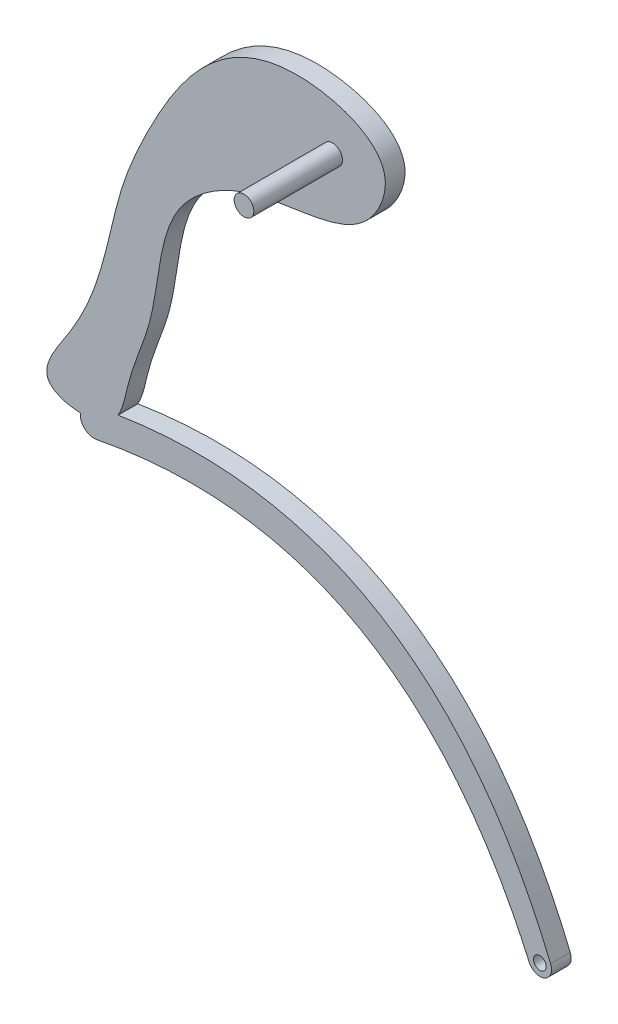
ISO-10303-21;
HEADER;
FILE_DESCRIPTION(('STEP AP214'),'2;1');
FILE_NAME('part.step','',(''),(''),'','','');
FILE_SCHEMA(('AUTOMOTIVE_DESIGN { 1 0 10303 214 1 1 1 1 }'));
ENDSEC;
DATA;
#1=APPLICATION_CONTEXT('core data for automotive mechanical design processes');
#2=APPLICATION_PROTOCOL_DEFINITION('international standard','automotive_design',2000,#1);
#3=PRODUCT_CONTEXT('',#1,'mechanical');
#4=PRODUCT('Part','Part','',(#3));
#5=PRODUCT_RELATED_PRODUCT_CATEGORY('part','',(#4));
#6=PRODUCT_DEFINITION_FORMATION('','',#4);
#7=PRODUCT_DEFINITION_CONTEXT('part definition',#1,'design');
#8=PRODUCT_DEFINITION('design','',#6,#7);
#9=PRODUCT_DEFINITION_SHAPE('','',#8);
#10=(LENGTH_UNIT() NAMED_UNIT(*) SI_UNIT(.MILLI.,.METRE.));
#11=(NAMED_UNIT(*) PLANE_ANGLE_UNIT() SI_UNIT($,.RADIAN.));
#12=(NAMED_UNIT(*) SI_UNIT($,.STERADIAN.) SOLID_ANGLE_UNIT());
#13=UNCERTAINTY_MEASURE_WITH_UNIT(LENGTH_MEASURE(1.E-05),#10,'distance_accuracy_value','');
#14=(GEOMETRIC_REPRESENTATION_CONTEXT(3) GLOBAL_UNCERTAINTY_ASSIGNED_CONTEXT((#13)) GLOBAL_UNIT_ASSIGNED_CONTEXT((#10,
#11,#12)) REPRESENTATION_CONTEXT('',''));
#15=CARTESIAN_POINT('',(0.,0.,0.));
#16=DIRECTION('',(0.,0.,1.));
#17=DIRECTION('',(1.,0.,0.));
#18=AXIS2_PLACEMENT_3D('',#15,#16,#17);
#19=CARTESIAN_POINT('',(-342.103839608546,136.7859344557,7.71496766092536));
#20=CARTESIAN_POINT('',(-342.805416317909,136.737134285568,7.71496766092536));
#21=CARTESIAN_POINT('',(-343.350392320336,135.938271274199,7.71496766092536));
#22=CARTESIAN_POINT('',(-343.929277023802,134.653574175049,7.71496766092536));
#23=CARTESIAN_POINT('',(-343.959759043496,133.780068687507,7.71496766092536));
#24=CARTESIAN_POINT('',(-344.782164003231,132.741129084263,7.71496766092536));
#25=CARTESIAN_POINT('',(-343.813205855734,132.64204980155,7.71496766092536));
#26=CARTESIAN_POINT('',(-343.727377066279,133.312892329857,7.71496766092536));
#27=CARTESIAN_POINT('',(-343.400763578783,133.970176465002,7.71496766092536));
#28=CARTESIAN_POINT('',(-343.424605917035,134.994278792171,7.71496766092536));
#29=CARTESIAN_POINT('',(-342.396685655235,135.686432799316,7.71496766092536));
#30=CARTESIAN_POINT('',(-341.342703143519,135.562089470068,7.71496766092536));
#31=CARTESIAN_POINT('',(-340.940991185741,136.593699019895,7.71496766092536));
#32=CARTESIAN_POINT('',(-341.67919726571,136.815471665672,7.71496766092536));
#33=CARTESIAN_POINT('',(-342.103839608546,136.7859344557,7.71496766092536));
#34=B_SPLINE_CURVE_WITH_KNOTS('',3,(#19,#20,#21,#22,#23,#24,#25,#26,#27,#28,#29,#30,#31,#32,
#33),.UNSPECIFIED.,.T.,.F.,(4,1,1,1,1,1,1,1,1,1,1,1,4),(0.,0.159177830000064,0.222571778534528,
0.367294655292266,0.418107249673309,0.471783736478388,0.513301840180607,0.572978205833702,
0.671765174880242,0.755128356265424,0.868017243335042,0.90365465991559,1.),.UNSPECIFIED.);
#35=DIRECTION('',(0.,0.,-1.));
#36=VECTOR('',#35,1.);
#37=SURFACE_OF_LINEAR_EXTRUSION('',#34,#36);
#38=DIRECTION('',(0.,0.,1.));
#39=VECTOR('',#38,1.);
#40=CARTESIAN_POINT('',(-343.822550388799,132.888043628324,7.61496766092535));
#41=LINE('',#40,#39);
#42=CARTESIAN_POINT('',(-343.822550388852,132.888043628316,7.51496766092535));
#43=VERTEX_POINT('',#42);
#44=CARTESIAN_POINT('',(-343.822550388852,132.888043628316,7.71496766092536));
#45=VERTEX_POINT('',#44);
#46=EDGE_CURVE('E60',#43,#45,#41,.T.);
#47=ORIENTED_EDGE('',*,*,#46,.F.);
#48=CARTESIAN_POINT('',(-342.103839608546,136.7859344557,7.51496766092535));
#49=CARTESIAN_POINT('',(-342.805416317909,136.737134285568,7.51496766092535));
#50=CARTESIAN_POINT('',(-343.350392320336,135.938271274199,7.51496766092535));
#51=CARTESIAN_POINT('',(-343.929277023802,134.653574175049,7.51496766092535));
#52=CARTESIAN_POINT('',(-343.959759043496,133.780068687507,7.51496766092535));
#53=CARTESIAN_POINT('',(-344.782164003231,132.741129084263,7.51496766092535));
#54=CARTESIAN_POINT('',(-343.813205855734,132.64204980155,7.51496766092535));
#55=CARTESIAN_POINT('',(-343.727377066279,133.312892329857,7.51496766092535));
#56=CARTESIAN_POINT('',(-343.400763578783,133.970176465002,7.51496766092535));
#57=CARTESIAN_POINT('',(-343.424605917035,134.994278792171,7.51496766092535));
#58=CARTESIAN_POINT('',(-342.396685655235,135.686432799316,7.51496766092535));
#59=CARTESIAN_POINT('',(-341.342703143519,135.562089470068,7.51496766092535));
#60=CARTESIAN_POINT('',(-340.940991185741,136.593699019895,7.51496766092535));
#61=CARTESIAN_POINT('',(-341.67919726571,136.815471665672,7.51496766092535));
#62=CARTESIAN_POINT('',(-342.103839608546,136.7859344557,7.51496766092535));
#63=B_SPLINE_CURVE_WITH_KNOTS('',3,(#48,#49,#50,#51,#52,#53,#54,#55,#56,#57,#58,#59,#60,#61,
#62),.UNSPECIFIED.,.T.,.F.,(4,1,1,1,1,1,1,1,1,1,1,1,4),(0.,0.159177830000064,0.222571778534528,
0.367294655292266,0.418107249673309,0.471783736478388,0.513301840180607,0.572978205833702,
0.671765174880242,0.755128356265424,0.868017243335042,0.90365465991559,1.),.UNSPECIFIED.);
#64=CARTESIAN_POINT('',(-344.205567025223,132.716546806324,7.51496766092535));
#65=VERTEX_POINT('',#64);
#66=EDGE_CURVE('E174',#43,#65,#63,.T.);
#67=ORIENTED_EDGE('',*,*,#66,.T.);
#68=DIRECTION('',(0.,0.,-1.));
#69=VECTOR('',#68,1.);
#70=CARTESIAN_POINT('',(-344.205567025223,132.716546806324,7.71496766092536));
#71=LINE('',#70,#69);
#72=CARTESIAN_POINT('',(-344.205567025223,132.716546806324,7.71496766092536));
#73=VERTEX_POINT('',#72);
#74=EDGE_CURVE('E131',#65,#73,#71,.F.);
#75=ORIENTED_EDGE('',*,*,#74,.T.);
#76=EDGE_CURVE('E44',#45,#73,#34,.T.);
#77=ORIENTED_EDGE('',*,*,#76,.F.);
#78=EDGE_LOOP('',(#47,#67,#75,#77));
#79=FACE_BOUND('',#78,.T.);
#80=ADVANCED_FACE('F35',(#79),#37,.F.);
#81=CARTESIAN_POINT('',(-343.757408261759,133.058778560271,7.71496766092536));
#82=DIRECTION('',(0.,0.,-1.));
#83=DIRECTION('',(-1.,0.,0.));
#84=AXIS2_PLACEMENT_3D('',#81,#82,#83);
#85=PLANE('',#84);
#86=CARTESIAN_POINT('',(-339.539284354937,130.211686137803,7.71496766092536));
#87=DIRECTION('',(0.,0.,1.));
#88=DIRECTION('',(1.,0.,0.));
#89=AXIS2_PLACEMENT_3D('',#86,#87,#88);
#90=CIRCLE('',#89,0.0648024293380558);
#91=CARTESIAN_POINT('',(-339.474481925599,130.211686137803,7.71496766092536));
#92=VERTEX_POINT('',#91);
#93=EDGE_CURVE('E194',#92,#92,#90,.T.);
#94=ORIENTED_EDGE('',*,*,#93,.F.);
#95=EDGE_LOOP('',(#94));
#96=FACE_BOUND('',#95,.T.);
#97=ORIENTED_EDGE('',*,*,#76,.T.);
#98=CARTESIAN_POINT('',(-344.066915578554,132.701169319651,7.71496766092536));
#99=DIRECTION('',(0.,0.,1.));
#100=DIRECTION('',(1.,0.,0.));
#101=AXIS2_PLACEMENT_3D('',#98,#99,#100);
#102=CIRCLE('',#101,0.139501579775661);
#103=CARTESIAN_POINT('',(-344.038536425968,132.564584860585,7.71496766092536));
#104=VERTEX_POINT('',#103);
#105=EDGE_CURVE('E52',#73,#104,#102,.T.);
#106=ORIENTED_EDGE('',*,*,#105,.T.);
#107=CARTESIAN_POINT('',(-344.038536425968,132.564584860585,7.71496766092536));
#108=CARTESIAN_POINT('',(-341.996789547392,132.960949860655,7.71496766092536));
#109=CARTESIAN_POINT('',(-340.533121693645,132.160648743439,7.71496766092536));
#110=CARTESIAN_POINT('',(-339.647532864715,130.163681508908,7.71496766092536));
#111=B_SPLINE_CURVE_WITH_KNOTS('',3,(#107,#108,#109,#110),.UNSPECIFIED.,.F.,.F.,(4,4),(0.,
0.973375657681869),.UNSPECIFIED.);
#112=CARTESIAN_POINT('',(-339.647532864715,130.163681508908,7.71496766092536));
#113=VERTEX_POINT('',#112);
#114=EDGE_CURVE('E110',#104,#113,#111,.T.);
#115=ORIENTED_EDGE('',*,*,#114,.T.);
#116=CARTESIAN_POINT('',(-339.539284354937,130.211686137803,7.71496766092536));
#117=DIRECTION('',(0.,0.,1.));
#118=DIRECTION('',(1.,0.,0.));
#119=AXIS2_PLACEMENT_3D('',#116,#117,#118);
#120=CIRCLE('',#119,0.118415304181697);
#121=CARTESIAN_POINT('',(-339.431035845159,130.259690766698,7.71496766092536));
#122=VERTEX_POINT('',#121);
#123=EDGE_CURVE('E102',#113,#122,#120,.T.);
#124=ORIENTED_EDGE('',*,*,#123,.T.);
#125=CARTESIAN_POINT('',(-344.095294731139,132.837753778718,7.71496766092536));
#126=CARTESIAN_POINT('',(-341.932162729999,133.287203544397,7.71496766092536));
#127=CARTESIAN_POINT('',(-340.331358608681,132.44262208393,7.71496766092536));
#128=CARTESIAN_POINT('',(-339.431035845159,130.259690766698,7.71496766092536));
#129=B_SPLINE_CURVE_WITH_KNOTS('',3,(#125,#126,#127,#128),.UNSPECIFIED.,.F.,.F.,(4,4),(0.,1.),.UNSPECIFIED.);
#130=EDGE_CURVE('E122',#45,#122,#129,.T.);
#131=ORIENTED_EDGE('',*,*,#130,.F.);
#132=EDGE_LOOP('',(#97,#106,#115,#124,#131));
#133=FACE_BOUND('',#132,.T.);
#134=CARTESIAN_POINT('',(-341.643961109613,136.271034235536,7.71496766092536));
#135=DIRECTION('',(0.,0.,-1.));
#136=DIRECTION('',(-1.,0.,0.));
#137=AXIS2_PLACEMENT_3D('',#134,#135,#136);
#138=CIRCLE('',#137,0.100000000000001);
#139=CARTESIAN_POINT('',(-341.743961109613,136.271034235536,7.71496766092536));
#140=VERTEX_POINT('',#139);
#141=EDGE_CURVE('E11',#140,#140,#138,.F.);
#142=ORIENTED_EDGE('',*,*,#141,.F.);
#143=EDGE_LOOP('',(#142));
#144=FACE_BOUND('',#143,.T.);
#145=ADVANCED_FACE('F159',(#96,#133,#144),#85,.F.);
#146=CARTESIAN_POINT('',(-343.757408261759,133.058778560271,7.51496766092535));
#147=DIRECTION('',(0.,0.,-1.));
#148=DIRECTION('',(-1.,0.,0.));
#149=AXIS2_PLACEMENT_3D('',#146,#147,#148);
#150=PLANE('',#149);
#151=CARTESIAN_POINT('',(-339.539284354937,130.211686137803,7.51496766092535));
#152=DIRECTION('',(0.,0.,-1.));
#153=DIRECTION('',(-1.,0.,0.));
#154=AXIS2_PLACEMENT_3D('',#151,#152,#153);
#155=CIRCLE('',#154,0.0648024293380558);
#156=CARTESIAN_POINT('',(-339.604086784275,130.211686137803,7.51496766092535));
#157=VERTEX_POINT('',#156);
#158=EDGE_CURVE('E39',#157,#157,#155,.T.);
#159=ORIENTED_EDGE('',*,*,#158,.F.);
#160=EDGE_LOOP('',(#159));
#161=FACE_BOUND('',#160,.T.);
#162=ORIENTED_EDGE('',*,*,#66,.F.);
#163=CARTESIAN_POINT('',(-344.095294731139,132.837753778718,7.51496766092535));
#164=CARTESIAN_POINT('',(-341.932162729999,133.287203544397,7.51496766092535));
#165=CARTESIAN_POINT('',(-340.331358608681,132.44262208393,7.51496766092535));
#166=CARTESIAN_POINT('',(-339.431035845159,130.259690766698,7.51496766092535));
#167=B_SPLINE_CURVE_WITH_KNOTS('',3,(#163,#164,#165,#166),.UNSPECIFIED.,.F.,.F.,(4,4),(0.,1.),.UNSPECIFIED.);
#168=CARTESIAN_POINT('',(-339.431035845159,130.259690766698,7.51496766092535));
#169=VERTEX_POINT('',#168);
#170=EDGE_CURVE('E92',#43,#169,#167,.T.);
#171=ORIENTED_EDGE('',*,*,#170,.T.);
#172=CARTESIAN_POINT('',(-339.539284354937,130.211686137803,7.51496766092535));
#173=DIRECTION('',(0.,0.,-1.));
#174=DIRECTION('',(-1.,0.,0.));
#175=AXIS2_PLACEMENT_3D('',#172,#173,#174);
#176=CIRCLE('',#175,0.118415304181697);
#177=CARTESIAN_POINT('',(-339.647532864715,130.163681508908,7.51496766092535));
#178=VERTEX_POINT('',#177);
#179=EDGE_CURVE('E84',#178,#169,#176,.F.);
#180=ORIENTED_EDGE('',*,*,#179,.F.);
#181=CARTESIAN_POINT('',(-344.038536425968,132.564584860585,7.51496766092535));
#182=CARTESIAN_POINT('',(-341.996789547392,132.960949860655,7.51496766092535));
#183=CARTESIAN_POINT('',(-340.533121693645,132.160648743439,7.51496766092535));
#184=CARTESIAN_POINT('',(-339.647532864715,130.163681508908,7.51496766092535));
#185=B_SPLINE_CURVE_WITH_KNOTS('',3,(#181,#182,#183,#184),.UNSPECIFIED.,.F.,.F.,(4,4),(0.,
0.973375657681869),.UNSPECIFIED.);
#186=CARTESIAN_POINT('',(-344.038536425968,132.564584860585,7.51496766092535));
#187=VERTEX_POINT('',#186);
#188=EDGE_CURVE('E90',#187,#178,#185,.T.);
#189=ORIENTED_EDGE('',*,*,#188,.F.);
#190=CARTESIAN_POINT('',(-344.066915578554,132.701169319651,7.51496766092535));
#191=DIRECTION('',(0.,0.,-1.));
#192=DIRECTION('',(-1.,0.,0.));
#193=AXIS2_PLACEMENT_3D('',#190,#191,#192);
#194=CIRCLE('',#193,0.139501579775661);
#195=EDGE_CURVE('E117',#65,#187,#194,.F.);
#196=ORIENTED_EDGE('',*,*,#195,.F.);
#197=EDGE_LOOP('',(#162,#171,#180,#189,#196));
#198=FACE_BOUND('',#197,.T.);
#199=ADVANCED_FACE('F87',(#161,#198),#150,.T.);
#200=CARTESIAN_POINT('',(-341.643961109613,136.271034235536,8.11496766092536));
#201=DIRECTION('',(0.,0.,-1.));
#202=DIRECTION('',(-1.,0.,0.));
#203=AXIS2_PLACEMENT_3D('',#200,#201,#202);
#204=CYLINDRICAL_SURFACE('',#203,0.100000000000001);
#205=ORIENTED_EDGE('',*,*,#141,.T.);
#206=EDGE_LOOP('',(#205));
#207=FACE_BOUND('',#206,.T.);
#208=CARTESIAN_POINT('',(-341.643961109613,136.271034235536,8.61496766092536));
#209=DIRECTION('',(0.,0.,1.));
#210=DIRECTION('',(1.,0.,0.));
#211=AXIS2_PLACEMENT_3D('',#208,#209,#210);
#212=CIRCLE('',#211,0.0999999999999913);
#213=CARTESIAN_POINT('',(-341.543961109613,136.271034235536,8.61496766092536));
#214=VERTEX_POINT('',#213);
#215=EDGE_CURVE('E205',#214,#214,#212,.T.);
#216=ORIENTED_EDGE('',*,*,#215,.F.);
#217=EDGE_LOOP('',(#216));
#218=FACE_BOUND('',#217,.T.);
#219=ADVANCED_FACE('F149',(#207,#218),#204,.T.);
#220=CARTESIAN_POINT('',(-344.095294731139,132.837753778718,1.88312375192182));
#221=CARTESIAN_POINT('',(-341.932162729999,133.287203544397,1.88312375192182));
#222=CARTESIAN_POINT('',(-340.331358608681,132.44262208393,1.88312375192182));
#223=CARTESIAN_POINT('',(-339.431035845159,130.259690766698,1.88312375192182));
#224=B_SPLINE_CURVE_WITH_KNOTS('',3,(#220,#221,#222,#223),.UNSPECIFIED.,.F.,.F.,(4,4),(0.,1.),.UNSPECIFIED.);
#225=DIRECTION('',(0.,0.,1.));
#226=VECTOR('',#225,1.);
#227=SURFACE_OF_LINEAR_EXTRUSION('',#224,#226);
#228=ORIENTED_EDGE('',*,*,#170,.F.);
#229=ORIENTED_EDGE('',*,*,#46,.T.);
#230=ORIENTED_EDGE('',*,*,#130,.T.);
#231=DIRECTION('',(0.,0.,1.));
#232=VECTOR('',#231,1.);
#233=CARTESIAN_POINT('',(-339.431035845159,130.259690766698,1.88312375192182));
#234=LINE('',#233,#232);
#235=EDGE_CURVE('E96',#169,#122,#234,.T.);
#236=ORIENTED_EDGE('',*,*,#235,.F.);
#237=EDGE_LOOP('',(#228,#229,#230,#236));
#238=FACE_BOUND('',#237,.T.);
#239=ADVANCED_FACE('F144',(#238),#227,.F.);
#240=CARTESIAN_POINT('',(-344.066915578554,132.701169319651,1.88312375192182));
#241=DIRECTION('',(0.,0.,1.));
#242=DIRECTION('',(1.,0.,0.));
#243=AXIS2_PLACEMENT_3D('',#240,#241,#242);
#244=CYLINDRICAL_SURFACE('',#243,0.139501579775661);
#245=ORIENTED_EDGE('',*,*,#74,.F.);
#246=ORIENTED_EDGE('',*,*,#195,.T.);
#247=DIRECTION('',(0.,0.,1.));
#248=VECTOR('',#247,1.);
#249=CARTESIAN_POINT('',(-344.038536425968,132.564584860585,1.88312375192182));
#250=LINE('',#249,#248);
#251=EDGE_CURVE('E108',#187,#104,#250,.T.);
#252=ORIENTED_EDGE('',*,*,#251,.T.);
#253=ORIENTED_EDGE('',*,*,#105,.F.);
#254=EDGE_LOOP('',(#245,#246,#252,#253));
#255=FACE_BOUND('',#254,.T.);
#256=ADVANCED_FACE('F148',(#255),#244,.T.);
#257=CARTESIAN_POINT('',(-344.038536425968,132.564584860585,1.88312375192182));
#258=CARTESIAN_POINT('',(-341.996789547392,132.960949860655,1.88312375192182));
#259=CARTESIAN_POINT('',(-340.533121693645,132.160648743439,1.88312375192182));
#260=CARTESIAN_POINT('',(-339.647532864715,130.163681508908,1.88312375192182));
#261=B_SPLINE_CURVE_WITH_KNOTS('',3,(#257,#258,#259,#260),.UNSPECIFIED.,.F.,.F.,(4,4),(0.,
0.973375657681869),.UNSPECIFIED.);
#262=DIRECTION('',(0.,0.,1.));
#263=VECTOR('',#262,1.);
#264=SURFACE_OF_LINEAR_EXTRUSION('',#261,#263);
#265=ORIENTED_EDGE('',*,*,#251,.F.);
#266=ORIENTED_EDGE('',*,*,#188,.T.);
#267=DIRECTION('',(0.,0.,1.));
#268=VECTOR('',#267,1.);
#269=CARTESIAN_POINT('',(-339.647532864715,130.163681508908,1.88312375192182));
#270=LINE('',#269,#268);
#271=EDGE_CURVE('E97',#178,#113,#270,.T.);
#272=ORIENTED_EDGE('',*,*,#271,.T.);
#273=ORIENTED_EDGE('',*,*,#114,.F.);
#274=EDGE_LOOP('',(#265,#266,#272,#273));
#275=FACE_BOUND('',#274,.T.);
#276=ADVANCED_FACE('F107',(#275),#264,.T.);
#277=CARTESIAN_POINT('',(-339.539284354937,130.211686137803,1.88312375192182));
#278=DIRECTION('',(0.,0.,1.));
#279=DIRECTION('',(1.,0.,0.));
#280=AXIS2_PLACEMENT_3D('',#277,#278,#279);
#281=CYLINDRICAL_SURFACE('',#280,0.118415304181697);
#282=ORIENTED_EDGE('',*,*,#271,.F.);
#283=ORIENTED_EDGE('',*,*,#179,.T.);
#284=ORIENTED_EDGE('',*,*,#235,.T.);
#285=ORIENTED_EDGE('',*,*,#123,.F.);
#286=EDGE_LOOP('',(#282,#283,#284,#285));
#287=FACE_BOUND('',#286,.T.);
#288=ADVANCED_FACE('F100',(#287),#281,.T.);
#289=CARTESIAN_POINT('',(-339.539284354937,130.211686137803,6.71496766092536));
#290=DIRECTION('',(0.,0.,1.));
#291=DIRECTION('',(1.,0.,0.));
#292=AXIS2_PLACEMENT_3D('',#289,#290,#291);
#293=CYLINDRICAL_SURFACE('',#292,0.0648024293380558);
#294=ORIENTED_EDGE('',*,*,#158,.T.);
#295=EDGE_LOOP('',(#294));
#296=FACE_BOUND('',#295,.T.);
#297=ORIENTED_EDGE('',*,*,#93,.T.);
#298=EDGE_LOOP('',(#297));
#299=FACE_BOUND('',#298,.T.);
#300=ADVANCED_FACE('F153',(#296,#299),#293,.F.);
#301=CARTESIAN_POINT('',(-341.643961109613,136.271034235536,8.61496766092536));
#302=DIRECTION('',(0.,0.,1.));
#303=DIRECTION('',(1.,0.,0.));
#304=AXIS2_PLACEMENT_3D('',#301,#302,#303);
#305=PLANE('',#304);
#306=ORIENTED_EDGE('',*,*,#215,.T.);
#307=EDGE_LOOP('',(#306));
#308=FACE_BOUND('',#307,.T.);
#309=ADVANCED_FACE('F209',(#308),#305,.T.);
#310=CLOSED_SHELL('',(#80,#145,#199,#219,#239,#256,#276,#288,#300,#309));
#311=MANIFOLD_SOLID_BREP('B2',#310);
#312=ADVANCED_BREP_SHAPE_REPRESENTATION('',(#18,#311),#14);
#313=SHAPE_DEFINITION_REPRESENTATION(#9,#312);
ENDSEC;
END-ISO-10303-21;
